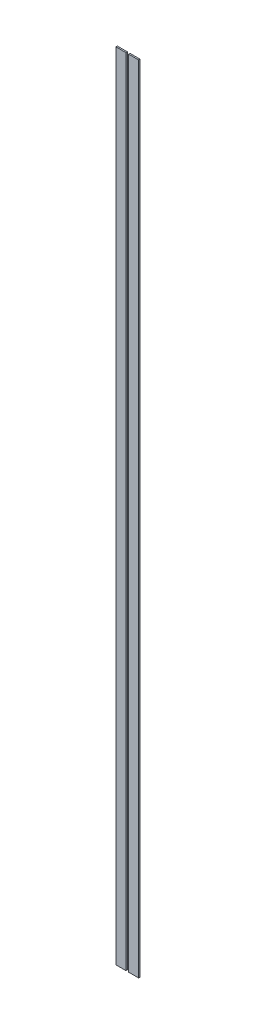
ISO-10303-21;
HEADER;
FILE_DESCRIPTION(('STEP AP214'),'2;1');
FILE_NAME('part.step','',(''),(''),'','','');
FILE_SCHEMA(('AUTOMOTIVE_DESIGN { 1 0 10303 214 1 1 1 1 }'));
ENDSEC;
DATA;
#1=APPLICATION_CONTEXT('core data for automotive mechanical design processes');
#2=APPLICATION_PROTOCOL_DEFINITION('international standard','automotive_design',2000,#1);
#3=PRODUCT_CONTEXT('',#1,'mechanical');
#4=PRODUCT('Part','Part','',(#3));
#5=PRODUCT_RELATED_PRODUCT_CATEGORY('part','',(#4));
#6=PRODUCT_DEFINITION_FORMATION('','',#4);
#7=PRODUCT_DEFINITION_CONTEXT('part definition',#1,'design');
#8=PRODUCT_DEFINITION('design','',#6,#7);
#9=PRODUCT_DEFINITION_SHAPE('','',#8);
#10=(LENGTH_UNIT() NAMED_UNIT(*) SI_UNIT(.MILLI.,.METRE.));
#11=(NAMED_UNIT(*) PLANE_ANGLE_UNIT() SI_UNIT($,.RADIAN.));
#12=(NAMED_UNIT(*) SI_UNIT($,.STERADIAN.) SOLID_ANGLE_UNIT());
#13=UNCERTAINTY_MEASURE_WITH_UNIT(LENGTH_MEASURE(1.E-05),#10,'distance_accuracy_value','');
#14=(GEOMETRIC_REPRESENTATION_CONTEXT(3) GLOBAL_UNCERTAINTY_ASSIGNED_CONTEXT((#13)) GLOBAL_UNIT_ASSIGNED_CONTEXT((#10,
#11,#12)) REPRESENTATION_CONTEXT('',''));
#15=CARTESIAN_POINT('',(0.,0.,0.));
#16=DIRECTION('',(0.,0.,1.));
#17=DIRECTION('',(1.,0.,0.));
#18=AXIS2_PLACEMENT_3D('',#15,#16,#17);
#19=CARTESIAN_POINT('',(7.99999999999998,280.,1.));
#20=DIRECTION('',(0.,-1.,0.));
#21=DIRECTION('',(0.,0.,-1.));
#22=AXIS2_PLACEMENT_3D('',#19,#20,#21);
#23=PLANE('',#22);
#24=DIRECTION('',(-1.,0.,0.));
#25=VECTOR('',#24,1.);
#26=CARTESIAN_POINT('',(7.99999999999998,280.,0.));
#27=LINE('',#26,#25);
#28=CARTESIAN_POINT('',(7.99999999999998,280.,0.));
#29=VERTEX_POINT('',#28);
#30=CARTESIAN_POINT('',(0.999999999999983,280.,0.));
#31=VERTEX_POINT('',#30);
#32=EDGE_CURVE('E89',#29,#31,#27,.T.);
#33=ORIENTED_EDGE('',*,*,#32,.T.);
#34=DIRECTION('',(0.,0.,-1.));
#35=VECTOR('',#34,1.);
#36=CARTESIAN_POINT('',(0.999999999999983,280.,1.));
#37=LINE('',#36,#35);
#38=CARTESIAN_POINT('',(0.999999999999983,280.,1.));
#39=VERTEX_POINT('',#38);
#40=EDGE_CURVE('E12',#39,#31,#37,.T.);
#41=ORIENTED_EDGE('',*,*,#40,.F.);
#42=DIRECTION('',(-1.,0.,0.));
#43=VECTOR('',#42,1.);
#44=CARTESIAN_POINT('',(7.99999999999998,280.,1.));
#45=LINE('',#44,#43);
#46=CARTESIAN_POINT('',(7.99999999999998,280.,1.));
#47=VERTEX_POINT('',#46);
#48=EDGE_CURVE('E107',#47,#39,#45,.T.);
#49=ORIENTED_EDGE('',*,*,#48,.F.);
#50=DIRECTION('',(0.,0.,-1.));
#51=VECTOR('',#50,1.);
#52=CARTESIAN_POINT('',(7.99999999999998,280.,1.));
#53=LINE('',#52,#51);
#54=EDGE_CURVE('E101',#47,#29,#53,.T.);
#55=ORIENTED_EDGE('',*,*,#54,.T.);
#56=EDGE_LOOP('',(#33,#41,#49,#55));
#57=FACE_BOUND('',#56,.T.);
#58=ADVANCED_FACE('F45',(#57),#23,.F.);
#59=CARTESIAN_POINT('',(0.999999999999983,280.,1.));
#60=DIRECTION('',(1.,0.,0.));
#61=DIRECTION('',(0.,1.,0.));
#62=AXIS2_PLACEMENT_3D('',#59,#60,#61);
#63=PLANE('',#62);
#64=DIRECTION('',(0.,-1.,0.));
#65=VECTOR('',#64,1.);
#66=CARTESIAN_POINT('',(0.999999999999983,280.,0.));
#67=LINE('',#66,#65);
#68=CARTESIAN_POINT('',(1.00000000000005,-280.,0.));
#69=VERTEX_POINT('',#68);
#70=EDGE_CURVE('E85',#31,#69,#67,.T.);
#71=ORIENTED_EDGE('',*,*,#70,.T.);
#72=DIRECTION('',(0.,0.,-1.));
#73=VECTOR('',#72,1.);
#74=CARTESIAN_POINT('',(1.00000000000005,-280.,1.));
#75=LINE('',#74,#73);
#76=CARTESIAN_POINT('',(1.00000000000005,-280.,1.));
#77=VERTEX_POINT('',#76);
#78=EDGE_CURVE('E52',#77,#69,#75,.T.);
#79=ORIENTED_EDGE('',*,*,#78,.F.);
#80=DIRECTION('',(0.,-1.,0.));
#81=VECTOR('',#80,1.);
#82=CARTESIAN_POINT('',(0.999999999999983,280.,1.));
#83=LINE('',#82,#81);
#84=EDGE_CURVE('E97',#39,#77,#83,.T.);
#85=ORIENTED_EDGE('',*,*,#84,.F.);
#86=ORIENTED_EDGE('',*,*,#40,.T.);
#87=EDGE_LOOP('',(#71,#79,#85,#86));
#88=FACE_BOUND('',#87,.T.);
#89=ADVANCED_FACE('F96',(#88),#63,.F.);
#90=CARTESIAN_POINT('',(8.00000000000002,-280.,1.));
#91=DIRECTION('',(0.,1.,0.));
#92=DIRECTION('',(0.,0.,1.));
#93=AXIS2_PLACEMENT_3D('',#90,#91,#92);
#94=PLANE('',#93);
#95=DIRECTION('',(1.,0.,0.));
#96=VECTOR('',#95,1.);
#97=CARTESIAN_POINT('',(8.00000000000002,-280.,0.));
#98=LINE('',#97,#96);
#99=CARTESIAN_POINT('',(8.00000000000002,-280.,0.));
#100=VERTEX_POINT('',#99);
#101=EDGE_CURVE('E90',#69,#100,#98,.T.);
#102=ORIENTED_EDGE('',*,*,#101,.T.);
#103=DIRECTION('',(0.,0.,-1.));
#104=VECTOR('',#103,1.);
#105=CARTESIAN_POINT('',(8.00000000000002,-280.,1.));
#106=LINE('',#105,#104);
#107=CARTESIAN_POINT('',(8.00000000000002,-280.,1.));
#108=VERTEX_POINT('',#107);
#109=EDGE_CURVE('E113',#108,#100,#106,.T.);
#110=ORIENTED_EDGE('',*,*,#109,.F.);
#111=DIRECTION('',(1.,0.,0.));
#112=VECTOR('',#111,1.);
#113=CARTESIAN_POINT('',(8.00000000000002,-280.,1.));
#114=LINE('',#113,#112);
#115=EDGE_CURVE('E64',#77,#108,#114,.T.);
#116=ORIENTED_EDGE('',*,*,#115,.F.);
#117=ORIENTED_EDGE('',*,*,#78,.T.);
#118=EDGE_LOOP('',(#102,#110,#116,#117));
#119=FACE_BOUND('',#118,.T.);
#120=ADVANCED_FACE('F116',(#119),#94,.F.);
#121=CARTESIAN_POINT('',(7.99999999999998,280.,1.));
#122=DIRECTION('',(-1.,0.,0.));
#123=DIRECTION('',(0.,-1.,0.));
#124=AXIS2_PLACEMENT_3D('',#121,#122,#123);
#125=PLANE('',#124);
#126=DIRECTION('',(0.,1.,0.));
#127=VECTOR('',#126,1.);
#128=CARTESIAN_POINT('',(7.99999999999998,280.,0.));
#129=LINE('',#128,#127);
#130=EDGE_CURVE('E105',#100,#29,#129,.T.);
#131=ORIENTED_EDGE('',*,*,#130,.T.);
#132=ORIENTED_EDGE('',*,*,#54,.F.);
#133=DIRECTION('',(0.,1.,0.));
#134=VECTOR('',#133,1.);
#135=CARTESIAN_POINT('',(7.99999999999998,280.,1.));
#136=LINE('',#135,#134);
#137=EDGE_CURVE('E59',#108,#47,#136,.T.);
#138=ORIENTED_EDGE('',*,*,#137,.F.);
#139=ORIENTED_EDGE('',*,*,#109,.T.);
#140=EDGE_LOOP('',(#131,#132,#138,#139));
#141=FACE_BOUND('',#140,.T.);
#142=ADVANCED_FACE('F118',(#141),#125,.F.);
#143=CARTESIAN_POINT('',(7.99999999999998,280.,1.));
#144=DIRECTION('',(0.,0.,1.));
#145=DIRECTION('',(1.,0.,0.));
#146=AXIS2_PLACEMENT_3D('',#143,#144,#145);
#147=PLANE('',#146);
#148=ORIENTED_EDGE('',*,*,#48,.T.);
#149=ORIENTED_EDGE('',*,*,#84,.T.);
#150=ORIENTED_EDGE('',*,*,#115,.T.);
#151=ORIENTED_EDGE('',*,*,#137,.T.);
#152=EDGE_LOOP('',(#148,#149,#150,#151));
#153=FACE_BOUND('',#152,.T.);
#154=ADVANCED_FACE('F119',(#153),#147,.T.);
#155=CARTESIAN_POINT('',(7.99999999999998,280.,0.));
#156=DIRECTION('',(0.,0.,1.));
#157=DIRECTION('',(1.,0.,0.));
#158=AXIS2_PLACEMENT_3D('',#155,#156,#157);
#159=PLANE('',#158);
#160=ORIENTED_EDGE('',*,*,#32,.F.);
#161=ORIENTED_EDGE('',*,*,#130,.F.);
#162=ORIENTED_EDGE('',*,*,#101,.F.);
#163=ORIENTED_EDGE('',*,*,#70,.F.);
#164=EDGE_LOOP('',(#160,#161,#162,#163));
#165=FACE_BOUND('',#164,.T.);
#166=ADVANCED_FACE('F86',(#165),#159,.F.);
#167=CLOSED_SHELL('',(#58,#89,#120,#142,#154,#166));
#168=MANIFOLD_SOLID_BREP('B2',#167);
#169=CARTESIAN_POINT('',(-7.99999999999998,280.,1.));
#170=DIRECTION('',(1.,0.,0.));
#171=DIRECTION('',(0.,1.,0.));
#172=AXIS2_PLACEMENT_3D('',#169,#170,#171);
#173=PLANE('',#172);
#174=DIRECTION('',(0.,-1.,0.));
#175=VECTOR('',#174,1.);
#176=CARTESIAN_POINT('',(-7.99999999999998,280.,0.));
#177=LINE('',#176,#175);
#178=CARTESIAN_POINT('',(-7.99999999999998,280.,0.));
#179=VERTEX_POINT('',#178);
#180=CARTESIAN_POINT('',(-8.00000000000002,-280.,0.));
#181=VERTEX_POINT('',#180);
#182=EDGE_CURVE('E213',#179,#181,#177,.T.);
#183=ORIENTED_EDGE('',*,*,#182,.T.);
#184=DIRECTION('',(0.,0.,-1.));
#185=VECTOR('',#184,1.);
#186=CARTESIAN_POINT('',(-8.00000000000002,-280.,1.));
#187=LINE('',#186,#185);
#188=CARTESIAN_POINT('',(-8.00000000000002,-280.,1.));
#189=VERTEX_POINT('',#188);
#190=EDGE_CURVE('E43',#189,#181,#187,.T.);
#191=ORIENTED_EDGE('',*,*,#190,.F.);
#192=DIRECTION('',(0.,-1.,0.));
#193=VECTOR('',#192,1.);
#194=CARTESIAN_POINT('',(-7.99999999999998,280.,1.));
#195=LINE('',#194,#193);
#196=CARTESIAN_POINT('',(-7.99999999999998,280.,1.));
#197=VERTEX_POINT('',#196);
#198=EDGE_CURVE('E231',#197,#189,#195,.T.);
#199=ORIENTED_EDGE('',*,*,#198,.F.);
#200=DIRECTION('',(0.,0.,-1.));
#201=VECTOR('',#200,1.);
#202=CARTESIAN_POINT('',(-7.99999999999998,280.,1.));
#203=LINE('',#202,#201);
#204=EDGE_CURVE('E225',#197,#179,#203,.T.);
#205=ORIENTED_EDGE('',*,*,#204,.T.);
#206=EDGE_LOOP('',(#183,#191,#199,#205));
#207=FACE_BOUND('',#206,.T.);
#208=ADVANCED_FACE('F169',(#207),#173,.F.);
#209=CARTESIAN_POINT('',(-8.00000000000002,-280.,1.));
#210=DIRECTION('',(0.,1.,0.));
#211=DIRECTION('',(0.,0.,1.));
#212=AXIS2_PLACEMENT_3D('',#209,#210,#211);
#213=PLANE('',#212);
#214=DIRECTION('',(1.,0.,0.));
#215=VECTOR('',#214,1.);
#216=CARTESIAN_POINT('',(-8.00000000000002,-280.,0.));
#217=LINE('',#216,#215);
#218=CARTESIAN_POINT('',(-1.00000000000005,-280.,0.));
#219=VERTEX_POINT('',#218);
#220=EDGE_CURVE('E209',#181,#219,#217,.T.);
#221=ORIENTED_EDGE('',*,*,#220,.T.);
#222=DIRECTION('',(0.,0.,-1.));
#223=VECTOR('',#222,1.);
#224=CARTESIAN_POINT('',(-1.00000000000005,-280.,1.));
#225=LINE('',#224,#223);
#226=CARTESIAN_POINT('',(-1.00000000000005,-280.,1.));
#227=VERTEX_POINT('',#226);
#228=EDGE_CURVE('E176',#227,#219,#225,.T.);
#229=ORIENTED_EDGE('',*,*,#228,.F.);
#230=DIRECTION('',(1.,0.,0.));
#231=VECTOR('',#230,1.);
#232=CARTESIAN_POINT('',(-8.00000000000002,-280.,1.));
#233=LINE('',#232,#231);
#234=EDGE_CURVE('E221',#189,#227,#233,.T.);
#235=ORIENTED_EDGE('',*,*,#234,.F.);
#236=ORIENTED_EDGE('',*,*,#190,.T.);
#237=EDGE_LOOP('',(#221,#229,#235,#236));
#238=FACE_BOUND('',#237,.T.);
#239=ADVANCED_FACE('F220',(#238),#213,.F.);
#240=CARTESIAN_POINT('',(-0.999999999999983,280.,1.));
#241=DIRECTION('',(-1.,0.,0.));
#242=DIRECTION('',(0.,-1.,0.));
#243=AXIS2_PLACEMENT_3D('',#240,#241,#242);
#244=PLANE('',#243);
#245=DIRECTION('',(0.,1.,0.));
#246=VECTOR('',#245,1.);
#247=CARTESIAN_POINT('',(-0.999999999999983,280.,0.));
#248=LINE('',#247,#246);
#249=CARTESIAN_POINT('',(-0.999999999999983,280.,0.));
#250=VERTEX_POINT('',#249);
#251=EDGE_CURVE('E214',#219,#250,#248,.T.);
#252=ORIENTED_EDGE('',*,*,#251,.T.);
#253=DIRECTION('',(0.,0.,-1.));
#254=VECTOR('',#253,1.);
#255=CARTESIAN_POINT('',(-0.999999999999983,280.,1.));
#256=LINE('',#255,#254);
#257=CARTESIAN_POINT('',(-0.999999999999983,280.,1.));
#258=VERTEX_POINT('',#257);
#259=EDGE_CURVE('E237',#258,#250,#256,.T.);
#260=ORIENTED_EDGE('',*,*,#259,.F.);
#261=DIRECTION('',(0.,1.,0.));
#262=VECTOR('',#261,1.);
#263=CARTESIAN_POINT('',(-0.999999999999983,280.,1.));
#264=LINE('',#263,#262);
#265=EDGE_CURVE('E188',#227,#258,#264,.T.);
#266=ORIENTED_EDGE('',*,*,#265,.F.);
#267=ORIENTED_EDGE('',*,*,#228,.T.);
#268=EDGE_LOOP('',(#252,#260,#266,#267));
#269=FACE_BOUND('',#268,.T.);
#270=ADVANCED_FACE('F240',(#269),#244,.F.);
#271=CARTESIAN_POINT('',(-7.99999999999998,280.,1.));
#272=DIRECTION('',(0.,-1.,0.));
#273=DIRECTION('',(0.,0.,-1.));
#274=AXIS2_PLACEMENT_3D('',#271,#272,#273);
#275=PLANE('',#274);
#276=DIRECTION('',(-1.,0.,0.));
#277=VECTOR('',#276,1.);
#278=CARTESIAN_POINT('',(-7.99999999999998,280.,0.));
#279=LINE('',#278,#277);
#280=EDGE_CURVE('E229',#250,#179,#279,.T.);
#281=ORIENTED_EDGE('',*,*,#280,.T.);
#282=ORIENTED_EDGE('',*,*,#204,.F.);
#283=DIRECTION('',(-1.,0.,0.));
#284=VECTOR('',#283,1.);
#285=CARTESIAN_POINT('',(-7.99999999999998,280.,1.));
#286=LINE('',#285,#284);
#287=EDGE_CURVE('E183',#258,#197,#286,.T.);
#288=ORIENTED_EDGE('',*,*,#287,.F.);
#289=ORIENTED_EDGE('',*,*,#259,.T.);
#290=EDGE_LOOP('',(#281,#282,#288,#289));
#291=FACE_BOUND('',#290,.T.);
#292=ADVANCED_FACE('F242',(#291),#275,.F.);
#293=CARTESIAN_POINT('',(-8.00000000000002,-280.,1.));
#294=DIRECTION('',(0.,0.,1.));
#295=DIRECTION('',(1.,0.,0.));
#296=AXIS2_PLACEMENT_3D('',#293,#294,#295);
#297=PLANE('',#296);
#298=ORIENTED_EDGE('',*,*,#198,.T.);
#299=ORIENTED_EDGE('',*,*,#234,.T.);
#300=ORIENTED_EDGE('',*,*,#265,.T.);
#301=ORIENTED_EDGE('',*,*,#287,.T.);
#302=EDGE_LOOP('',(#298,#299,#300,#301));
#303=FACE_BOUND('',#302,.T.);
#304=ADVANCED_FACE('F243',(#303),#297,.T.);
#305=CARTESIAN_POINT('',(-8.00000000000002,-280.,0.));
#306=DIRECTION('',(0.,0.,1.));
#307=DIRECTION('',(1.,0.,0.));
#308=AXIS2_PLACEMENT_3D('',#305,#306,#307);
#309=PLANE('',#308);
#310=ORIENTED_EDGE('',*,*,#182,.F.);
#311=ORIENTED_EDGE('',*,*,#280,.F.);
#312=ORIENTED_EDGE('',*,*,#251,.F.);
#313=ORIENTED_EDGE('',*,*,#220,.F.);
#314=EDGE_LOOP('',(#310,#311,#312,#313));
#315=FACE_BOUND('',#314,.T.);
#316=ADVANCED_FACE('F210',(#315),#309,.F.);
#317=CLOSED_SHELL('',(#208,#239,#270,#292,#304,#316));
#318=MANIFOLD_SOLID_BREP('B6',#317);
#319=ADVANCED_BREP_SHAPE_REPRESENTATION('',(#18,#168,#318),#14);
#320=SHAPE_DEFINITION_REPRESENTATION(#9,#319);
ENDSEC;
END-ISO-10303-21;
